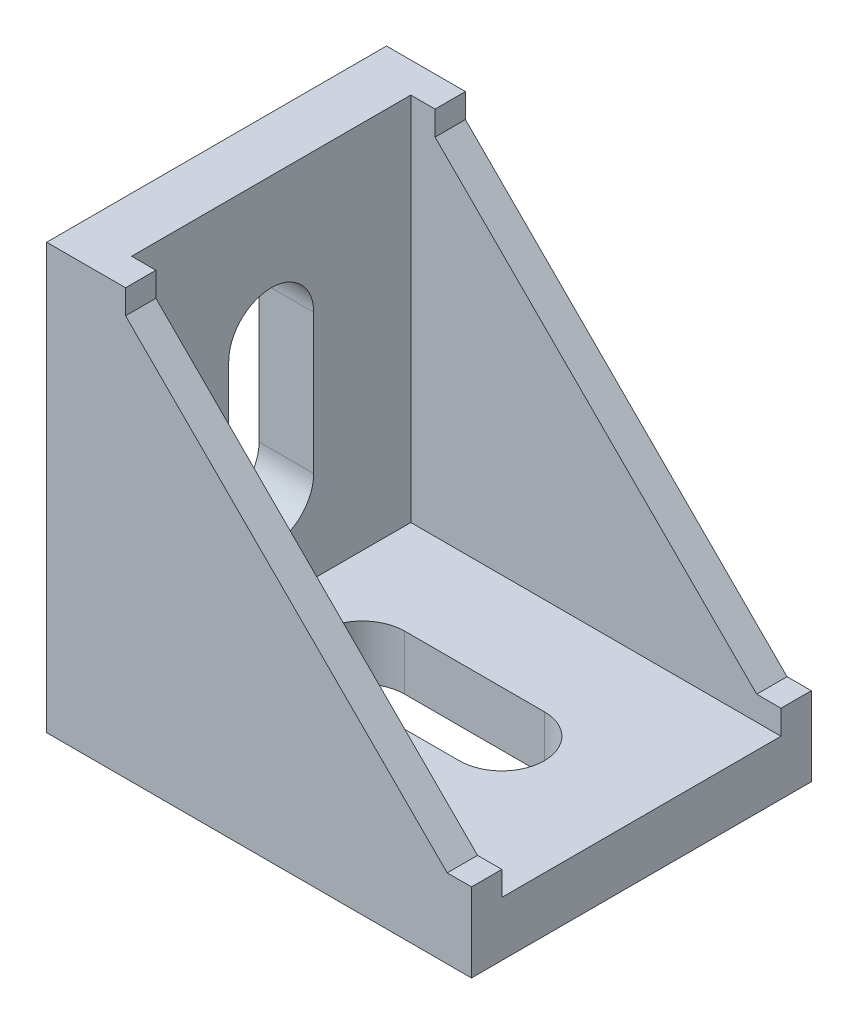
ISO-10303-21;
HEADER;
FILE_DESCRIPTION(('STEP AP214'),'2;1');
FILE_NAME('part.step','',(''),(''),'','','');
FILE_SCHEMA(('AUTOMOTIVE_DESIGN { 1 0 10303 214 1 1 1 1 }'));
ENDSEC;
DATA;
#1=APPLICATION_CONTEXT('core data for automotive mechanical design processes');
#2=APPLICATION_PROTOCOL_DEFINITION('international standard','automotive_design',2000,#1);
#3=PRODUCT_CONTEXT('',#1,'mechanical');
#4=PRODUCT('Part','Part','',(#3));
#5=PRODUCT_RELATED_PRODUCT_CATEGORY('part','',(#4));
#6=PRODUCT_DEFINITION_FORMATION('','',#4);
#7=PRODUCT_DEFINITION_CONTEXT('part definition',#1,'design');
#8=PRODUCT_DEFINITION('design','',#6,#7);
#9=PRODUCT_DEFINITION_SHAPE('','',#8);
#10=(LENGTH_UNIT() NAMED_UNIT(*) SI_UNIT(.MILLI.,.METRE.));
#11=(NAMED_UNIT(*) PLANE_ANGLE_UNIT() SI_UNIT($,.RADIAN.));
#12=(NAMED_UNIT(*) SI_UNIT($,.STERADIAN.) SOLID_ANGLE_UNIT());
#13=UNCERTAINTY_MEASURE_WITH_UNIT(LENGTH_MEASURE(1.E-05),#10,'distance_accuracy_value','');
#14=(GEOMETRIC_REPRESENTATION_CONTEXT(3) GLOBAL_UNCERTAINTY_ASSIGNED_CONTEXT((#13)) GLOBAL_UNIT_ASSIGNED_CONTEXT((#10,
#11,#12)) REPRESENTATION_CONTEXT('',''));
#15=CARTESIAN_POINT('',(0.,0.,0.));
#16=DIRECTION('',(0.,0.,1.));
#17=DIRECTION('',(1.,0.,0.));
#18=AXIS2_PLACEMENT_3D('',#15,#16,#17);
#19=CARTESIAN_POINT('',(0.,0.,28.));
#20=DIRECTION('',(1.,0.,0.));
#21=DIRECTION('',(0.,0.,-1.));
#22=AXIS2_PLACEMENT_3D('',#19,#20,#21);
#23=PLANE('',#22);
#24=DIRECTION('',(0.,-1.,0.));
#25=VECTOR('',#24,1.);
#26=CARTESIAN_POINT('',(0.,0.,0.));
#27=LINE('',#26,#25);
#28=CARTESIAN_POINT('',(0.,35.,0.));
#29=VERTEX_POINT('',#28);
#30=CARTESIAN_POINT('',(0.,0.,0.));
#31=VERTEX_POINT('',#30);
#32=EDGE_CURVE('E415',#29,#31,#27,.T.);
#33=ORIENTED_EDGE('',*,*,#32,.T.);
#34=DIRECTION('',(0.,0.,-1.));
#35=VECTOR('',#34,1.);
#36=CARTESIAN_POINT('',(0.,0.,28.));
#37=LINE('',#36,#35);
#38=CARTESIAN_POINT('',(0.,0.,28.));
#39=VERTEX_POINT('',#38);
#40=EDGE_CURVE('E441',#39,#31,#37,.T.);
#41=ORIENTED_EDGE('',*,*,#40,.F.);
#42=DIRECTION('',(0.,-1.,0.));
#43=VECTOR('',#42,1.);
#44=CARTESIAN_POINT('',(0.,0.,28.));
#45=LINE('',#44,#43);
#46=CARTESIAN_POINT('',(0.,35.,28.));
#47=VERTEX_POINT('',#46);
#48=EDGE_CURVE('E416',#47,#39,#45,.T.);
#49=ORIENTED_EDGE('',*,*,#48,.F.);
#50=DIRECTION('',(0.,0.,-1.));
#51=VECTOR('',#50,1.);
#52=CARTESIAN_POINT('',(0.,35.,28.));
#53=LINE('',#52,#51);
#54=EDGE_CURVE('E427',#47,#29,#53,.T.);
#55=ORIENTED_EDGE('',*,*,#54,.T.);
#56=EDGE_LOOP('',(#33,#41,#49,#55));
#57=FACE_BOUND('',#56,.T.);
#58=DIRECTION('',(0.,-1.,0.));
#59=VECTOR('',#58,1.);
#60=CARTESIAN_POINT('',(0.,23.5,10.5));
#61=LINE('',#60,#59);
#62=CARTESIAN_POINT('',(0.,23.5,10.5));
#63=VERTEX_POINT('',#62);
#64=CARTESIAN_POINT('',(0.,12.,10.5));
#65=VERTEX_POINT('',#64);
#66=EDGE_CURVE('E322',#63,#65,#61,.T.);
#67=ORIENTED_EDGE('',*,*,#66,.F.);
#68=CARTESIAN_POINT('',(0.,23.5,14.));
#69=DIRECTION('',(1.,0.,0.));
#70=DIRECTION('',(0.,0.,-1.));
#71=AXIS2_PLACEMENT_3D('',#68,#69,#70);
#72=CIRCLE('',#71,3.5);
#73=CARTESIAN_POINT('',(0.,23.5,17.5));
#74=VERTEX_POINT('',#73);
#75=EDGE_CURVE('E325',#74,#63,#72,.F.);
#76=ORIENTED_EDGE('',*,*,#75,.F.);
#77=DIRECTION('',(0.,1.,0.));
#78=VECTOR('',#77,1.);
#79=CARTESIAN_POINT('',(0.,12.,17.5));
#80=LINE('',#79,#78);
#81=CARTESIAN_POINT('',(0.,12.,17.5));
#82=VERTEX_POINT('',#81);
#83=EDGE_CURVE('E327',#82,#74,#80,.T.);
#84=ORIENTED_EDGE('',*,*,#83,.F.);
#85=CARTESIAN_POINT('',(0.,12.,14.));
#86=DIRECTION('',(1.,0.,0.));
#87=DIRECTION('',(0.,0.,-1.));
#88=AXIS2_PLACEMENT_3D('',#85,#86,#87);
#89=CIRCLE('',#88,3.5);
#90=EDGE_CURVE('E319',#65,#82,#89,.F.);
#91=ORIENTED_EDGE('',*,*,#90,.F.);
#92=EDGE_LOOP('',(#67,#76,#84,#91));
#93=FACE_BOUND('',#92,.T.);
#94=DIRECTION('',(0.,-1.,0.));
#95=VECTOR('',#94,1.);
#96=CARTESIAN_POINT('',(0.,34.,11.1));
#97=LINE('',#96,#95);
#98=CARTESIAN_POINT('',(0.,34.,11.1));
#99=VERTEX_POINT('',#98);
#100=CARTESIAN_POINT('',(0.,33.,11.1));
#101=VERTEX_POINT('',#100);
#102=EDGE_CURVE('E250',#99,#101,#97,.T.);
#103=ORIENTED_EDGE('',*,*,#102,.F.);
#104=DIRECTION('',(0.,0.,-1.));
#105=VECTOR('',#104,1.);
#106=CARTESIAN_POINT('',(0.,34.,16.9));
#107=LINE('',#106,#105);
#108=CARTESIAN_POINT('',(0.,34.,16.9));
#109=VERTEX_POINT('',#108);
#110=EDGE_CURVE('E247',#109,#99,#107,.T.);
#111=ORIENTED_EDGE('',*,*,#110,.F.);
#112=DIRECTION('',(0.,1.,0.));
#113=VECTOR('',#112,1.);
#114=CARTESIAN_POINT('',(0.,34.,16.9));
#115=LINE('',#114,#113);
#116=CARTESIAN_POINT('',(0.,33.,16.9));
#117=VERTEX_POINT('',#116);
#118=EDGE_CURVE('E53',#117,#109,#115,.T.);
#119=ORIENTED_EDGE('',*,*,#118,.F.);
#120=DIRECTION('',(0.,0.,1.));
#121=VECTOR('',#120,1.);
#122=CARTESIAN_POINT('',(0.,33.,16.9));
#123=LINE('',#122,#121);
#124=EDGE_CURVE('E48',#101,#117,#123,.T.);
#125=ORIENTED_EDGE('',*,*,#124,.F.);
#126=EDGE_LOOP('',(#103,#111,#119,#125));
#127=FACE_BOUND('',#126,.T.);
#128=ADVANCED_FACE('F34',(#57,#93,#127),#23,.F.);
#129=CARTESIAN_POINT('',(0.,0.,28.));
#130=DIRECTION('',(0.,1.,0.));
#131=DIRECTION('',(0.,0.,1.));
#132=AXIS2_PLACEMENT_3D('',#129,#130,#131);
#133=PLANE('',#132);
#134=DIRECTION('',(1.,0.,0.));
#135=VECTOR('',#134,1.);
#136=CARTESIAN_POINT('',(0.,0.,0.));
#137=LINE('',#136,#135);
#138=CARTESIAN_POINT('',(35.,0.,0.));
#139=VERTEX_POINT('',#138);
#140=EDGE_CURVE('E430',#31,#139,#137,.T.);
#141=ORIENTED_EDGE('',*,*,#140,.T.);
#142=DIRECTION('',(0.,0.,-1.));
#143=VECTOR('',#142,1.);
#144=CARTESIAN_POINT('',(35.,0.,28.));
#145=LINE('',#144,#143);
#146=CARTESIAN_POINT('',(35.,0.,28.));
#147=VERTEX_POINT('',#146);
#148=EDGE_CURVE('E438',#147,#139,#145,.T.);
#149=ORIENTED_EDGE('',*,*,#148,.F.);
#150=DIRECTION('',(1.,0.,0.));
#151=VECTOR('',#150,1.);
#152=CARTESIAN_POINT('',(0.,0.,28.));
#153=LINE('',#152,#151);
#154=EDGE_CURVE('E419',#39,#147,#153,.T.);
#155=ORIENTED_EDGE('',*,*,#154,.F.);
#156=ORIENTED_EDGE('',*,*,#40,.T.);
#157=EDGE_LOOP('',(#141,#149,#155,#156));
#158=FACE_BOUND('',#157,.T.);
#159=DIRECTION('',(-1.,0.,0.));
#160=VECTOR('',#159,1.);
#161=CARTESIAN_POINT('',(23.5,0.,17.5));
#162=LINE('',#161,#160);
#163=CARTESIAN_POINT('',(23.5,0.,17.5));
#164=VERTEX_POINT('',#163);
#165=CARTESIAN_POINT('',(12.,0.,17.5));
#166=VERTEX_POINT('',#165);
#167=EDGE_CURVE('E293',#164,#166,#162,.T.);
#168=ORIENTED_EDGE('',*,*,#167,.F.);
#169=CARTESIAN_POINT('',(23.5,0.,14.));
#170=DIRECTION('',(0.,1.,0.));
#171=DIRECTION('',(0.,0.,1.));
#172=AXIS2_PLACEMENT_3D('',#169,#170,#171);
#173=CIRCLE('',#172,3.5);
#174=CARTESIAN_POINT('',(23.5,0.,10.5));
#175=VERTEX_POINT('',#174);
#176=EDGE_CURVE('E296',#175,#164,#173,.F.);
#177=ORIENTED_EDGE('',*,*,#176,.F.);
#178=DIRECTION('',(1.,0.,0.));
#179=VECTOR('',#178,1.);
#180=CARTESIAN_POINT('',(12.,0.,10.5));
#181=LINE('',#180,#179);
#182=CARTESIAN_POINT('',(12.,0.,10.5));
#183=VERTEX_POINT('',#182);
#184=EDGE_CURVE('E298',#183,#175,#181,.T.);
#185=ORIENTED_EDGE('',*,*,#184,.F.);
#186=CARTESIAN_POINT('',(12.,0.,14.));
#187=DIRECTION('',(0.,1.,0.));
#188=DIRECTION('',(0.,0.,1.));
#189=AXIS2_PLACEMENT_3D('',#186,#187,#188);
#190=CIRCLE('',#189,3.5);
#191=EDGE_CURVE('E290',#166,#183,#190,.F.);
#192=ORIENTED_EDGE('',*,*,#191,.F.);
#193=EDGE_LOOP('',(#168,#177,#185,#192));
#194=FACE_BOUND('',#193,.T.);
#195=DIRECTION('',(-1.,0.,0.));
#196=VECTOR('',#195,1.);
#197=CARTESIAN_POINT('',(34.,0.,16.9));
#198=LINE('',#197,#196);
#199=CARTESIAN_POINT('',(34.,0.,16.9));
#200=VERTEX_POINT('',#199);
#201=CARTESIAN_POINT('',(33.,0.,16.9));
#202=VERTEX_POINT('',#201);
#203=EDGE_CURVE('E251',#200,#202,#198,.T.);
#204=ORIENTED_EDGE('',*,*,#203,.F.);
#205=DIRECTION('',(0.,0.,1.));
#206=VECTOR('',#205,1.);
#207=CARTESIAN_POINT('',(34.,0.,16.9));
#208=LINE('',#207,#206);
#209=CARTESIAN_POINT('',(34.,0.,11.1));
#210=VERTEX_POINT('',#209);
#211=EDGE_CURVE('E264',#210,#200,#208,.T.);
#212=ORIENTED_EDGE('',*,*,#211,.F.);
#213=DIRECTION('',(1.,0.,0.));
#214=VECTOR('',#213,1.);
#215=CARTESIAN_POINT('',(34.,0.,11.1));
#216=LINE('',#215,#214);
#217=CARTESIAN_POINT('',(33.,0.,11.1));
#218=VERTEX_POINT('',#217);
#219=EDGE_CURVE('E273',#218,#210,#216,.T.);
#220=ORIENTED_EDGE('',*,*,#219,.F.);
#221=DIRECTION('',(0.,0.,-1.));
#222=VECTOR('',#221,1.);
#223=CARTESIAN_POINT('',(33.,0.,16.9));
#224=LINE('',#223,#222);
#225=EDGE_CURVE('E254',#202,#218,#224,.T.);
#226=ORIENTED_EDGE('',*,*,#225,.F.);
#227=EDGE_LOOP('',(#204,#212,#220,#226));
#228=FACE_BOUND('',#227,.T.);
#229=ADVANCED_FACE('F495',(#158,#194,#228),#133,.F.);
#230=CARTESIAN_POINT('',(6.5,37.0820212779744,0.));
#231=DIRECTION('',(-1.,0.,0.));
#232=DIRECTION('',(0.,0.,1.));
#233=AXIS2_PLACEMENT_3D('',#230,#231,#232);
#234=PLANE('',#233);
#235=DIRECTION('',(0.,0.,1.));
#236=VECTOR('',#235,1.);
#237=CARTESIAN_POINT('',(6.5,33.,0.));
#238=LINE('',#237,#236);
#239=CARTESIAN_POINT('',(6.5,33.,25.5));
#240=VERTEX_POINT('',#239);
#241=CARTESIAN_POINT('',(6.5,33.,28.));
#242=VERTEX_POINT('',#241);
#243=EDGE_CURVE('E404',#240,#242,#238,.T.);
#244=ORIENTED_EDGE('',*,*,#243,.F.);
#245=DIRECTION('',(0.,1.,0.));
#246=VECTOR('',#245,1.);
#247=CARTESIAN_POINT('',(6.5,37.0820212779744,25.5));
#248=LINE('',#247,#246);
#249=CARTESIAN_POINT('',(6.5,35.,25.5));
#250=VERTEX_POINT('',#249);
#251=EDGE_CURVE('E378',#240,#250,#248,.T.);
#252=ORIENTED_EDGE('',*,*,#251,.T.);
#253=DIRECTION('',(0.,0.,-1.));
#254=VECTOR('',#253,1.);
#255=CARTESIAN_POINT('',(6.5,35.,28.));
#256=LINE('',#255,#254);
#257=CARTESIAN_POINT('',(6.5,35.,28.));
#258=VERTEX_POINT('',#257);
#259=EDGE_CURVE('E412',#258,#250,#256,.T.);
#260=ORIENTED_EDGE('',*,*,#259,.F.);
#261=DIRECTION('',(0.,-1.,0.));
#262=VECTOR('',#261,1.);
#263=CARTESIAN_POINT('',(6.5,37.0820212779744,28.));
#264=LINE('',#263,#262);
#265=EDGE_CURVE('E389',#258,#242,#264,.T.);
#266=ORIENTED_EDGE('',*,*,#265,.T.);
#267=EDGE_LOOP('',(#244,#252,#260,#266));
#268=FACE_BOUND('',#267,.T.);
#269=ADVANCED_FACE('F456',(#268),#234,.F.);
#270=CARTESIAN_POINT('',(33.,6.5,0.));
#271=DIRECTION('',(0.,-1.,0.));
#272=DIRECTION('',(0.,0.,-1.));
#273=AXIS2_PLACEMENT_3D('',#270,#271,#272);
#274=PLANE('',#273);
#275=DIRECTION('',(0.,0.,1.));
#276=VECTOR('',#275,1.);
#277=CARTESIAN_POINT('',(35.,6.5,28.));
#278=LINE('',#277,#276);
#279=CARTESIAN_POINT('',(35.,6.5,25.5));
#280=VERTEX_POINT('',#279);
#281=CARTESIAN_POINT('',(35.,6.5,28.));
#282=VERTEX_POINT('',#281);
#283=EDGE_CURVE('E403',#280,#282,#278,.T.);
#284=ORIENTED_EDGE('',*,*,#283,.F.);
#285=DIRECTION('',(-1.,0.,0.));
#286=VECTOR('',#285,1.);
#287=CARTESIAN_POINT('',(33.,6.5,25.5));
#288=LINE('',#287,#286);
#289=CARTESIAN_POINT('',(33.,6.5,25.5));
#290=VERTEX_POINT('',#289);
#291=EDGE_CURVE('E375',#280,#290,#288,.T.);
#292=ORIENTED_EDGE('',*,*,#291,.T.);
#293=DIRECTION('',(0.,0.,1.));
#294=VECTOR('',#293,1.);
#295=CARTESIAN_POINT('',(33.,6.5,0.));
#296=LINE('',#295,#294);
#297=CARTESIAN_POINT('',(33.,6.5,28.));
#298=VERTEX_POINT('',#297);
#299=EDGE_CURVE('E392',#290,#298,#296,.T.);
#300=ORIENTED_EDGE('',*,*,#299,.T.);
#301=DIRECTION('',(1.,0.,0.));
#302=VECTOR('',#301,1.);
#303=CARTESIAN_POINT('',(33.,6.5,28.));
#304=LINE('',#303,#302);
#305=EDGE_CURVE('E395',#298,#282,#304,.T.);
#306=ORIENTED_EDGE('',*,*,#305,.T.);
#307=EDGE_LOOP('',(#284,#292,#300,#306));
#308=FACE_BOUND('',#307,.T.);
#309=ADVANCED_FACE('F466',(#308),#274,.F.);
#310=CARTESIAN_POINT('',(6.5,33.,0.));
#311=DIRECTION('',(-0.707106781186547,-0.707106781186547,0.));
#312=DIRECTION('',(0.707106781186548,-0.707106781186548,0.));
#313=AXIS2_PLACEMENT_3D('',#310,#311,#312);
#314=PLANE('',#313);
#315=ORIENTED_EDGE('',*,*,#299,.F.);
#316=DIRECTION('',(-0.707106781186548,0.707106781186548,0.));
#317=VECTOR('',#316,1.);
#318=CARTESIAN_POINT('',(6.5,33.,25.5));
#319=LINE('',#318,#317);
#320=EDGE_CURVE('E41',#290,#240,#319,.T.);
#321=ORIENTED_EDGE('',*,*,#320,.T.);
#322=ORIENTED_EDGE('',*,*,#243,.T.);
#323=DIRECTION('',(0.707106781186548,-0.707106781186548,0.));
#324=VECTOR('',#323,1.);
#325=CARTESIAN_POINT('',(6.5,33.,28.));
#326=LINE('',#325,#324);
#327=EDGE_CURVE('E384',#242,#298,#326,.T.);
#328=ORIENTED_EDGE('',*,*,#327,.T.);
#329=EDGE_LOOP('',(#315,#321,#322,#328));
#330=FACE_BOUND('',#329,.T.);
#331=ADVANCED_FACE('F453',(#330),#314,.F.);
#332=CARTESIAN_POINT('',(35.,0.,28.));
#333=DIRECTION('',(-1.,0.,0.));
#334=DIRECTION('',(0.,0.,1.));
#335=AXIS2_PLACEMENT_3D('',#332,#333,#334);
#336=PLANE('',#335);
#337=DIRECTION('',(0.,0.,-1.));
#338=VECTOR('',#337,1.);
#339=CARTESIAN_POINT('',(35.,4.5,25.5));
#340=LINE('',#339,#338);
#341=CARTESIAN_POINT('',(35.,4.5,25.5));
#342=VERTEX_POINT('',#341);
#343=CARTESIAN_POINT('',(35.,4.5,2.5));
#344=VERTEX_POINT('',#343);
#345=EDGE_CURVE('E348',#342,#344,#340,.T.);
#346=ORIENTED_EDGE('',*,*,#345,.F.);
#347=DIRECTION('',(0.,-1.,0.));
#348=VECTOR('',#347,1.);
#349=CARTESIAN_POINT('',(35.,38.2170301545957,25.5));
#350=LINE('',#349,#348);
#351=EDGE_CURVE('E350',#280,#342,#350,.T.);
#352=ORIENTED_EDGE('',*,*,#351,.F.);
#353=ORIENTED_EDGE('',*,*,#283,.T.);
#354=DIRECTION('',(0.,1.,0.));
#355=VECTOR('',#354,1.);
#356=CARTESIAN_POINT('',(35.,0.,28.));
#357=LINE('',#356,#355);
#358=EDGE_CURVE('E422',#147,#282,#357,.T.);
#359=ORIENTED_EDGE('',*,*,#358,.F.);
#360=ORIENTED_EDGE('',*,*,#148,.T.);
#361=DIRECTION('',(0.,1.,0.));
#362=VECTOR('',#361,1.);
#363=CARTESIAN_POINT('',(35.,0.,0.));
#364=LINE('',#363,#362);
#365=CARTESIAN_POINT('',(35.,6.5,0.));
#366=VERTEX_POINT('',#365);
#367=EDGE_CURVE('E432',#139,#366,#364,.T.);
#368=ORIENTED_EDGE('',*,*,#367,.T.);
#369=CARTESIAN_POINT('',(35.,6.5,2.5));
#370=VERTEX_POINT('',#369);
#371=EDGE_CURVE('E408',#366,#370,#278,.T.);
#372=ORIENTED_EDGE('',*,*,#371,.T.);
#373=DIRECTION('',(0.,1.,0.));
#374=VECTOR('',#373,1.);
#375=CARTESIAN_POINT('',(35.,38.2170301545957,2.5));
#376=LINE('',#375,#374);
#377=EDGE_CURVE('E353',#344,#370,#376,.T.);
#378=ORIENTED_EDGE('',*,*,#377,.F.);
#379=EDGE_LOOP('',(#346,#352,#353,#359,#360,#368,#372,#378));
#380=FACE_BOUND('',#379,.T.);
#381=ADVANCED_FACE('F472',(#380),#336,.F.);
#382=CARTESIAN_POINT('',(0.,35.,28.));
#383=DIRECTION('',(0.,-1.,0.));
#384=DIRECTION('',(0.,0.,-1.));
#385=AXIS2_PLACEMENT_3D('',#382,#383,#384);
#386=PLANE('',#385);
#387=ORIENTED_EDGE('',*,*,#259,.T.);
#388=DIRECTION('',(-1.,0.,0.));
#389=VECTOR('',#388,1.);
#390=CARTESIAN_POINT('',(0.,35.,25.5));
#391=LINE('',#390,#389);
#392=CARTESIAN_POINT('',(4.5,35.,25.5));
#393=VERTEX_POINT('',#392);
#394=EDGE_CURVE('E381',#250,#393,#391,.T.);
#395=ORIENTED_EDGE('',*,*,#394,.T.);
#396=DIRECTION('',(0.,0.,-1.));
#397=VECTOR('',#396,1.);
#398=CARTESIAN_POINT('',(4.5,35.,28.));
#399=LINE('',#398,#397);
#400=CARTESIAN_POINT('',(4.5,35.,2.5));
#401=VERTEX_POINT('',#400);
#402=EDGE_CURVE('E11',#393,#401,#399,.T.);
#403=ORIENTED_EDGE('',*,*,#402,.T.);
#404=DIRECTION('',(1.,0.,0.));
#405=VECTOR('',#404,1.);
#406=CARTESIAN_POINT('',(0.,35.,2.5));
#407=LINE('',#406,#405);
#408=CARTESIAN_POINT('',(6.5,35.,2.5));
#409=VERTEX_POINT('',#408);
#410=EDGE_CURVE('E372',#401,#409,#407,.T.);
#411=ORIENTED_EDGE('',*,*,#410,.T.);
#412=CARTESIAN_POINT('',(6.5,35.,0.));
#413=VERTEX_POINT('',#412);
#414=EDGE_CURVE('E411',#409,#413,#256,.T.);
#415=ORIENTED_EDGE('',*,*,#414,.T.);
#416=DIRECTION('',(-1.,0.,0.));
#417=VECTOR('',#416,1.);
#418=CARTESIAN_POINT('',(0.,35.,0.));
#419=LINE('',#418,#417);
#420=EDGE_CURVE('E420',#413,#29,#419,.T.);
#421=ORIENTED_EDGE('',*,*,#420,.T.);
#422=ORIENTED_EDGE('',*,*,#54,.F.);
#423=DIRECTION('',(-1.,0.,0.));
#424=VECTOR('',#423,1.);
#425=CARTESIAN_POINT('',(0.,35.,28.));
#426=LINE('',#425,#424);
#427=EDGE_CURVE('E425',#258,#47,#426,.T.);
#428=ORIENTED_EDGE('',*,*,#427,.F.);
#429=EDGE_LOOP('',(#387,#395,#403,#411,#415,#421,#422,#428));
#430=FACE_BOUND('',#429,.T.);
#431=ADVANCED_FACE('F485',(#430),#386,.F.);
#432=CARTESIAN_POINT('',(0.,0.,28.));
#433=DIRECTION('',(0.,0.,-1.));
#434=DIRECTION('',(-1.,0.,0.));
#435=AXIS2_PLACEMENT_3D('',#432,#433,#434);
#436=PLANE('',#435);
#437=ORIENTED_EDGE('',*,*,#327,.F.);
#438=ORIENTED_EDGE('',*,*,#265,.F.);
#439=ORIENTED_EDGE('',*,*,#427,.T.);
#440=ORIENTED_EDGE('',*,*,#48,.T.);
#441=ORIENTED_EDGE('',*,*,#154,.T.);
#442=ORIENTED_EDGE('',*,*,#358,.T.);
#443=ORIENTED_EDGE('',*,*,#305,.F.);
#444=EDGE_LOOP('',(#437,#438,#439,#440,#441,#442,#443));
#445=FACE_BOUND('',#444,.T.);
#446=ADVANCED_FACE('F462',(#445),#436,.F.);
#447=CARTESIAN_POINT('',(0.,0.,0.));
#448=DIRECTION('',(0.,0.,-1.));
#449=DIRECTION('',(-1.,0.,0.));
#450=AXIS2_PLACEMENT_3D('',#447,#448,#449);
#451=PLANE('',#450);
#452=DIRECTION('',(0.,1.,0.));
#453=VECTOR('',#452,1.);
#454=CARTESIAN_POINT('',(6.5,0.,0.));
#455=LINE('',#454,#453);
#456=CARTESIAN_POINT('',(6.5,33.,0.));
#457=VERTEX_POINT('',#456);
#458=EDGE_CURVE('E444',#457,#413,#455,.T.);
#459=ORIENTED_EDGE('',*,*,#458,.F.);
#460=DIRECTION('',(0.707106781186548,-0.707106781186548,0.));
#461=VECTOR('',#460,1.);
#462=CARTESIAN_POINT('',(6.5,33.,0.));
#463=LINE('',#462,#461);
#464=CARTESIAN_POINT('',(33.,6.5,0.));
#465=VERTEX_POINT('',#464);
#466=EDGE_CURVE('E385',#457,#465,#463,.T.);
#467=ORIENTED_EDGE('',*,*,#466,.T.);
#468=DIRECTION('',(1.,0.,0.));
#469=VECTOR('',#468,1.);
#470=CARTESIAN_POINT('',(33.,6.5,0.));
#471=LINE('',#470,#469);
#472=EDGE_CURVE('E388',#465,#366,#471,.T.);
#473=ORIENTED_EDGE('',*,*,#472,.T.);
#474=ORIENTED_EDGE('',*,*,#367,.F.);
#475=ORIENTED_EDGE('',*,*,#140,.F.);
#476=ORIENTED_EDGE('',*,*,#32,.F.);
#477=ORIENTED_EDGE('',*,*,#420,.F.);
#478=EDGE_LOOP('',(#459,#467,#473,#474,#475,#476,#477));
#479=FACE_BOUND('',#478,.T.);
#480=ADVANCED_FACE('F500',(#479),#451,.T.);
#481=ORIENTED_EDGE('',*,*,#414,.F.);
#482=DIRECTION('',(0.,-1.,0.));
#483=VECTOR('',#482,1.);
#484=CARTESIAN_POINT('',(6.5,37.0820212779744,2.5));
#485=LINE('',#484,#483);
#486=CARTESIAN_POINT('',(6.5,33.,2.5));
#487=VERTEX_POINT('',#486);
#488=EDGE_CURVE('E369',#409,#487,#485,.T.);
#489=ORIENTED_EDGE('',*,*,#488,.T.);
#490=EDGE_CURVE('E400',#457,#487,#238,.T.);
#491=ORIENTED_EDGE('',*,*,#490,.F.);
#492=ORIENTED_EDGE('',*,*,#458,.T.);
#493=EDGE_LOOP('',(#481,#489,#491,#492));
#494=FACE_BOUND('',#493,.T.);
#495=ADVANCED_FACE('F508',(#494),#234,.F.);
#496=CARTESIAN_POINT('',(33.,6.5,2.5));
#497=VERTEX_POINT('',#496);
#498=EDGE_CURVE('E405',#465,#497,#296,.T.);
#499=ORIENTED_EDGE('',*,*,#498,.T.);
#500=DIRECTION('',(1.,0.,0.));
#501=VECTOR('',#500,1.);
#502=CARTESIAN_POINT('',(33.,6.5,2.5));
#503=LINE('',#502,#501);
#504=EDGE_CURVE('E366',#497,#370,#503,.T.);
#505=ORIENTED_EDGE('',*,*,#504,.T.);
#506=ORIENTED_EDGE('',*,*,#371,.F.);
#507=ORIENTED_EDGE('',*,*,#472,.F.);
#508=EDGE_LOOP('',(#499,#505,#506,#507));
#509=FACE_BOUND('',#508,.T.);
#510=ADVANCED_FACE('F504',(#509),#274,.F.);
#511=ORIENTED_EDGE('',*,*,#490,.T.);
#512=DIRECTION('',(0.707106781186548,-0.707106781186548,0.));
#513=VECTOR('',#512,1.);
#514=CARTESIAN_POINT('',(6.5,33.,2.5));
#515=LINE('',#514,#513);
#516=EDGE_CURVE('E447',#487,#497,#515,.T.);
#517=ORIENTED_EDGE('',*,*,#516,.T.);
#518=ORIENTED_EDGE('',*,*,#498,.F.);
#519=ORIENTED_EDGE('',*,*,#466,.F.);
#520=EDGE_LOOP('',(#511,#517,#518,#519));
#521=FACE_BOUND('',#520,.T.);
#522=ADVANCED_FACE('F506',(#521),#314,.F.);
#523=CARTESIAN_POINT('',(4.5,0.,0.));
#524=DIRECTION('',(-1.,0.,0.));
#525=DIRECTION('',(0.,0.,1.));
#526=AXIS2_PLACEMENT_3D('',#523,#524,#525);
#527=PLANE('',#526);
#528=DIRECTION('',(0.,-1.,0.));
#529=VECTOR('',#528,1.);
#530=CARTESIAN_POINT('',(4.5,12.,17.5));
#531=LINE('',#530,#529);
#532=CARTESIAN_POINT('',(4.5,23.5,17.5));
#533=VERTEX_POINT('',#532);
#534=CARTESIAN_POINT('',(4.5,12.,17.5));
#535=VERTEX_POINT('',#534);
#536=EDGE_CURVE('E329',#533,#535,#531,.T.);
#537=ORIENTED_EDGE('',*,*,#536,.F.);
#538=CARTESIAN_POINT('',(4.5,23.5,14.));
#539=DIRECTION('',(1.,0.,0.));
#540=DIRECTION('',(0.,0.,-1.));
#541=AXIS2_PLACEMENT_3D('',#538,#539,#540);
#542=CIRCLE('',#541,3.5);
#543=CARTESIAN_POINT('',(4.5,23.5,10.5));
#544=VERTEX_POINT('',#543);
#545=EDGE_CURVE('E318',#544,#533,#542,.T.);
#546=ORIENTED_EDGE('',*,*,#545,.F.);
#547=DIRECTION('',(0.,1.,0.));
#548=VECTOR('',#547,1.);
#549=CARTESIAN_POINT('',(4.5,23.5,10.5));
#550=LINE('',#549,#548);
#551=CARTESIAN_POINT('',(4.5,12.,10.5));
#552=VERTEX_POINT('',#551);
#553=EDGE_CURVE('E335',#552,#544,#550,.T.);
#554=ORIENTED_EDGE('',*,*,#553,.F.);
#555=CARTESIAN_POINT('',(4.5,12.,14.));
#556=DIRECTION('',(1.,0.,0.));
#557=DIRECTION('',(0.,0.,-1.));
#558=AXIS2_PLACEMENT_3D('',#555,#556,#557);
#559=CIRCLE('',#558,3.5);
#560=EDGE_CURVE('E332',#535,#552,#559,.T.);
#561=ORIENTED_EDGE('',*,*,#560,.F.);
#562=EDGE_LOOP('',(#537,#546,#554,#561));
#563=FACE_BOUND('',#562,.T.);
#564=DIRECTION('',(0.,1.,0.));
#565=VECTOR('',#564,1.);
#566=CARTESIAN_POINT('',(4.5,38.2170301545957,25.5));
#567=LINE('',#566,#565);
#568=CARTESIAN_POINT('',(4.5,4.5,25.5));
#569=VERTEX_POINT('',#568);
#570=EDGE_CURVE('E358',#569,#393,#567,.T.);
#571=ORIENTED_EDGE('',*,*,#570,.F.);
#572=DIRECTION('',(0.,0.,1.));
#573=VECTOR('',#572,1.);
#574=CARTESIAN_POINT('',(4.5,4.5,25.5));
#575=LINE('',#574,#573);
#576=CARTESIAN_POINT('',(4.5,4.5,2.5));
#577=VERTEX_POINT('',#576);
#578=EDGE_CURVE('E355',#577,#569,#575,.T.);
#579=ORIENTED_EDGE('',*,*,#578,.F.);
#580=DIRECTION('',(0.,-1.,0.));
#581=VECTOR('',#580,1.);
#582=CARTESIAN_POINT('',(4.5,38.2170301545957,2.5));
#583=LINE('',#582,#581);
#584=EDGE_CURVE('E347',#401,#577,#583,.T.);
#585=ORIENTED_EDGE('',*,*,#584,.F.);
#586=ORIENTED_EDGE('',*,*,#402,.F.);
#587=EDGE_LOOP('',(#571,#579,#585,#586));
#588=FACE_BOUND('',#587,.T.);
#589=ADVANCED_FACE('F483',(#563,#588),#527,.F.);
#590=CARTESIAN_POINT('',(75.8146802320674,38.2170301545957,25.5));
#591=DIRECTION('',(0.,0.,1.));
#592=DIRECTION('',(1.,0.,0.));
#593=AXIS2_PLACEMENT_3D('',#590,#591,#592);
#594=PLANE('',#593);
#595=ORIENTED_EDGE('',*,*,#251,.F.);
#596=ORIENTED_EDGE('',*,*,#320,.F.);
#597=ORIENTED_EDGE('',*,*,#291,.F.);
#598=ORIENTED_EDGE('',*,*,#351,.T.);
#599=DIRECTION('',(-1.,0.,0.));
#600=VECTOR('',#599,1.);
#601=CARTESIAN_POINT('',(75.8146802320674,4.5,25.5));
#602=LINE('',#601,#600);
#603=EDGE_CURVE('E351',#342,#569,#602,.T.);
#604=ORIENTED_EDGE('',*,*,#603,.T.);
#605=ORIENTED_EDGE('',*,*,#570,.T.);
#606=ORIENTED_EDGE('',*,*,#394,.F.);
#607=EDGE_LOOP('',(#595,#596,#597,#598,#604,#605,#606));
#608=FACE_BOUND('',#607,.T.);
#609=ADVANCED_FACE('F468',(#608),#594,.F.);
#610=CARTESIAN_POINT('',(75.8146802320674,38.2170301545957,2.5));
#611=DIRECTION('',(0.,0.,-1.));
#612=DIRECTION('',(-1.,0.,0.));
#613=AXIS2_PLACEMENT_3D('',#610,#611,#612);
#614=PLANE('',#613);
#615=ORIENTED_EDGE('',*,*,#584,.T.);
#616=DIRECTION('',(-1.,0.,0.));
#617=VECTOR('',#616,1.);
#618=CARTESIAN_POINT('',(75.8146802320674,4.5,2.5));
#619=LINE('',#618,#617);
#620=EDGE_CURVE('E361',#344,#577,#619,.T.);
#621=ORIENTED_EDGE('',*,*,#620,.F.);
#622=ORIENTED_EDGE('',*,*,#377,.T.);
#623=ORIENTED_EDGE('',*,*,#504,.F.);
#624=ORIENTED_EDGE('',*,*,#516,.F.);
#625=ORIENTED_EDGE('',*,*,#488,.F.);
#626=ORIENTED_EDGE('',*,*,#410,.F.);
#627=EDGE_LOOP('',(#615,#621,#622,#623,#624,#625,#626));
#628=FACE_BOUND('',#627,.T.);
#629=ADVANCED_FACE('F479',(#628),#614,.F.);
#630=CARTESIAN_POINT('',(75.8146802320674,4.5,25.5));
#631=DIRECTION('',(0.,-1.,0.));
#632=DIRECTION('',(0.,0.,-1.));
#633=AXIS2_PLACEMENT_3D('',#630,#631,#632);
#634=PLANE('',#633);
#635=DIRECTION('',(-1.,0.,0.));
#636=VECTOR('',#635,1.);
#637=CARTESIAN_POINT('',(12.,4.5,10.5));
#638=LINE('',#637,#636);
#639=CARTESIAN_POINT('',(23.5,4.5,10.5));
#640=VERTEX_POINT('',#639);
#641=CARTESIAN_POINT('',(12.,4.5,10.5));
#642=VERTEX_POINT('',#641);
#643=EDGE_CURVE('E300',#640,#642,#638,.T.);
#644=ORIENTED_EDGE('',*,*,#643,.F.);
#645=CARTESIAN_POINT('',(23.5,4.5,14.));
#646=DIRECTION('',(0.,1.,0.));
#647=DIRECTION('',(0.,0.,1.));
#648=AXIS2_PLACEMENT_3D('',#645,#646,#647);
#649=CIRCLE('',#648,3.5);
#650=CARTESIAN_POINT('',(23.5,4.5,17.5));
#651=VERTEX_POINT('',#650);
#652=EDGE_CURVE('E289',#651,#640,#649,.T.);
#653=ORIENTED_EDGE('',*,*,#652,.F.);
#654=DIRECTION('',(1.,0.,0.));
#655=VECTOR('',#654,1.);
#656=CARTESIAN_POINT('',(23.5,4.5,17.5));
#657=LINE('',#656,#655);
#658=CARTESIAN_POINT('',(12.,4.5,17.5));
#659=VERTEX_POINT('',#658);
#660=EDGE_CURVE('E306',#659,#651,#657,.T.);
#661=ORIENTED_EDGE('',*,*,#660,.F.);
#662=CARTESIAN_POINT('',(12.,4.5,14.));
#663=DIRECTION('',(0.,1.,0.));
#664=DIRECTION('',(0.,0.,1.));
#665=AXIS2_PLACEMENT_3D('',#662,#663,#664);
#666=CIRCLE('',#665,3.5);
#667=EDGE_CURVE('E303',#642,#659,#666,.T.);
#668=ORIENTED_EDGE('',*,*,#667,.F.);
#669=EDGE_LOOP('',(#644,#653,#661,#668));
#670=FACE_BOUND('',#669,.T.);
#671=ORIENTED_EDGE('',*,*,#345,.T.);
#672=ORIENTED_EDGE('',*,*,#620,.T.);
#673=ORIENTED_EDGE('',*,*,#578,.T.);
#674=ORIENTED_EDGE('',*,*,#603,.F.);
#675=EDGE_LOOP('',(#671,#672,#673,#674));
#676=FACE_BOUND('',#675,.T.);
#677=ADVANCED_FACE('F476',(#670,#676),#634,.F.);
#678=CARTESIAN_POINT('',(-19.7800404448525,23.5,14.));
#679=DIRECTION('',(1.,0.,0.));
#680=DIRECTION('',(0.,0.,-1.));
#681=AXIS2_PLACEMENT_3D('',#678,#679,#680);
#682=CYLINDRICAL_SURFACE('',#681,3.5);
#683=ORIENTED_EDGE('',*,*,#75,.T.);
#684=DIRECTION('',(1.,0.,0.));
#685=VECTOR('',#684,1.);
#686=CARTESIAN_POINT('',(-19.7800404448525,23.5,10.5));
#687=LINE('',#686,#685);
#688=EDGE_CURVE('E323',#63,#544,#687,.T.);
#689=ORIENTED_EDGE('',*,*,#688,.T.);
#690=ORIENTED_EDGE('',*,*,#545,.T.);
#691=DIRECTION('',(1.,0.,0.));
#692=VECTOR('',#691,1.);
#693=CARTESIAN_POINT('',(-19.7800404448525,23.5,17.5));
#694=LINE('',#693,#692);
#695=EDGE_CURVE('E338',#74,#533,#694,.T.);
#696=ORIENTED_EDGE('',*,*,#695,.F.);
#697=EDGE_LOOP('',(#683,#689,#690,#696));
#698=FACE_BOUND('',#697,.T.);
#699=ADVANCED_FACE('F619',(#698),#682,.F.);
#700=CARTESIAN_POINT('',(-19.7800404448525,23.5,10.5));
#701=DIRECTION('',(0.,0.,-1.));
#702=DIRECTION('',(-1.,0.,0.));
#703=AXIS2_PLACEMENT_3D('',#700,#701,#702);
#704=PLANE('',#703);
#705=ORIENTED_EDGE('',*,*,#66,.T.);
#706=DIRECTION('',(1.,0.,0.));
#707=VECTOR('',#706,1.);
#708=CARTESIAN_POINT('',(-19.7800404448525,12.,10.5));
#709=LINE('',#708,#707);
#710=EDGE_CURVE('E340',#65,#552,#709,.T.);
#711=ORIENTED_EDGE('',*,*,#710,.T.);
#712=ORIENTED_EDGE('',*,*,#553,.T.);
#713=ORIENTED_EDGE('',*,*,#688,.F.);
#714=EDGE_LOOP('',(#705,#711,#712,#713));
#715=FACE_BOUND('',#714,.T.);
#716=ADVANCED_FACE('F624',(#715),#704,.F.);
#717=CARTESIAN_POINT('',(-19.7800404448525,12.,14.));
#718=DIRECTION('',(1.,0.,0.));
#719=DIRECTION('',(0.,0.,-1.));
#720=AXIS2_PLACEMENT_3D('',#717,#718,#719);
#721=CYLINDRICAL_SURFACE('',#720,3.5);
#722=ORIENTED_EDGE('',*,*,#90,.T.);
#723=DIRECTION('',(1.,0.,0.));
#724=VECTOR('',#723,1.);
#725=CARTESIAN_POINT('',(-19.7800404448525,12.,17.5));
#726=LINE('',#725,#724);
#727=EDGE_CURVE('E342',#82,#535,#726,.T.);
#728=ORIENTED_EDGE('',*,*,#727,.T.);
#729=ORIENTED_EDGE('',*,*,#560,.T.);
#730=ORIENTED_EDGE('',*,*,#710,.F.);
#731=EDGE_LOOP('',(#722,#728,#729,#730));
#732=FACE_BOUND('',#731,.T.);
#733=ADVANCED_FACE('F634',(#732),#721,.F.);
#734=CARTESIAN_POINT('',(-19.7800404448525,12.,17.5));
#735=DIRECTION('',(0.,0.,1.));
#736=DIRECTION('',(1.,0.,0.));
#737=AXIS2_PLACEMENT_3D('',#734,#735,#736);
#738=PLANE('',#737);
#739=ORIENTED_EDGE('',*,*,#83,.T.);
#740=ORIENTED_EDGE('',*,*,#695,.T.);
#741=ORIENTED_EDGE('',*,*,#536,.T.);
#742=ORIENTED_EDGE('',*,*,#727,.F.);
#743=EDGE_LOOP('',(#739,#740,#741,#742));
#744=FACE_BOUND('',#743,.T.);
#745=ADVANCED_FACE('F644',(#744),#738,.F.);
#746=CARTESIAN_POINT('',(23.5,-19.7800404448525,14.));
#747=DIRECTION('',(0.,1.,0.));
#748=DIRECTION('',(0.,0.,1.));
#749=AXIS2_PLACEMENT_3D('',#746,#747,#748);
#750=CYLINDRICAL_SURFACE('',#749,3.5);
#751=ORIENTED_EDGE('',*,*,#176,.T.);
#752=DIRECTION('',(0.,1.,0.));
#753=VECTOR('',#752,1.);
#754=CARTESIAN_POINT('',(23.5,-19.7800404448525,17.5));
#755=LINE('',#754,#753);
#756=EDGE_CURVE('E294',#164,#651,#755,.T.);
#757=ORIENTED_EDGE('',*,*,#756,.T.);
#758=ORIENTED_EDGE('',*,*,#652,.T.);
#759=DIRECTION('',(0.,1.,0.));
#760=VECTOR('',#759,1.);
#761=CARTESIAN_POINT('',(23.5,-19.7800404448525,10.5));
#762=LINE('',#761,#760);
#763=EDGE_CURVE('E309',#175,#640,#762,.T.);
#764=ORIENTED_EDGE('',*,*,#763,.F.);
#765=EDGE_LOOP('',(#751,#757,#758,#764));
#766=FACE_BOUND('',#765,.T.);
#767=ADVANCED_FACE('F654',(#766),#750,.F.);
#768=CARTESIAN_POINT('',(23.5,-19.7800404448525,17.5));
#769=DIRECTION('',(0.,0.,1.));
#770=DIRECTION('',(1.,0.,0.));
#771=AXIS2_PLACEMENT_3D('',#768,#769,#770);
#772=PLANE('',#771);
#773=ORIENTED_EDGE('',*,*,#167,.T.);
#774=DIRECTION('',(0.,1.,0.));
#775=VECTOR('',#774,1.);
#776=CARTESIAN_POINT('',(12.,-19.7800404448525,17.5));
#777=LINE('',#776,#775);
#778=EDGE_CURVE('E311',#166,#659,#777,.T.);
#779=ORIENTED_EDGE('',*,*,#778,.T.);
#780=ORIENTED_EDGE('',*,*,#660,.T.);
#781=ORIENTED_EDGE('',*,*,#756,.F.);
#782=EDGE_LOOP('',(#773,#779,#780,#781));
#783=FACE_BOUND('',#782,.T.);
#784=ADVANCED_FACE('F671',(#783),#772,.F.);
#785=CARTESIAN_POINT('',(12.,-19.7800404448525,14.));
#786=DIRECTION('',(0.,1.,0.));
#787=DIRECTION('',(0.,0.,1.));
#788=AXIS2_PLACEMENT_3D('',#785,#786,#787);
#789=CYLINDRICAL_SURFACE('',#788,3.5);
#790=ORIENTED_EDGE('',*,*,#191,.T.);
#791=DIRECTION('',(0.,1.,0.));
#792=VECTOR('',#791,1.);
#793=CARTESIAN_POINT('',(12.,-19.7800404448525,10.5));
#794=LINE('',#793,#792);
#795=EDGE_CURVE('E313',#183,#642,#794,.T.);
#796=ORIENTED_EDGE('',*,*,#795,.T.);
#797=ORIENTED_EDGE('',*,*,#667,.T.);
#798=ORIENTED_EDGE('',*,*,#778,.F.);
#799=EDGE_LOOP('',(#790,#796,#797,#798));
#800=FACE_BOUND('',#799,.T.);
#801=ADVANCED_FACE('F681',(#800),#789,.F.);
#802=CARTESIAN_POINT('',(12.,-19.7800404448525,10.5));
#803=DIRECTION('',(0.,0.,-1.));
#804=DIRECTION('',(-1.,0.,0.));
#805=AXIS2_PLACEMENT_3D('',#802,#803,#804);
#806=PLANE('',#805);
#807=ORIENTED_EDGE('',*,*,#184,.T.);
#808=ORIENTED_EDGE('',*,*,#763,.T.);
#809=ORIENTED_EDGE('',*,*,#643,.T.);
#810=ORIENTED_EDGE('',*,*,#795,.F.);
#811=EDGE_LOOP('',(#807,#808,#809,#810));
#812=FACE_BOUND('',#811,.T.);
#813=ADVANCED_FACE('F691',(#812),#806,.F.);
#814=CARTESIAN_POINT('',(34.,-1.,16.9));
#815=DIRECTION('',(0.,0.,-1.));
#816=DIRECTION('',(-1.,0.,0.));
#817=AXIS2_PLACEMENT_3D('',#814,#815,#816);
#818=PLANE('',#817);
#819=ORIENTED_EDGE('',*,*,#203,.T.);
#820=DIRECTION('',(0.,1.,0.));
#821=VECTOR('',#820,1.);
#822=CARTESIAN_POINT('',(33.,-1.,16.9));
#823=LINE('',#822,#821);
#824=CARTESIAN_POINT('',(33.,-1.,16.9));
#825=VERTEX_POINT('',#824);
#826=EDGE_CURVE('E286',#825,#202,#823,.T.);
#827=ORIENTED_EDGE('',*,*,#826,.F.);
#828=DIRECTION('',(-1.,0.,0.));
#829=VECTOR('',#828,1.);
#830=CARTESIAN_POINT('',(34.,-1.,16.9));
#831=LINE('',#830,#829);
#832=CARTESIAN_POINT('',(34.,-1.,16.9));
#833=VERTEX_POINT('',#832);
#834=EDGE_CURVE('E260',#833,#825,#831,.T.);
#835=ORIENTED_EDGE('',*,*,#834,.F.);
#836=DIRECTION('',(0.,1.,0.));
#837=VECTOR('',#836,1.);
#838=CARTESIAN_POINT('',(34.,-1.,16.9));
#839=LINE('',#838,#837);
#840=EDGE_CURVE('E269',#833,#200,#839,.T.);
#841=ORIENTED_EDGE('',*,*,#840,.T.);
#842=EDGE_LOOP('',(#819,#827,#835,#841));
#843=FACE_BOUND('',#842,.T.);
#844=ADVANCED_FACE('F700',(#843),#818,.F.);
#845=CARTESIAN_POINT('',(33.,-1.,16.9));
#846=DIRECTION('',(1.,0.,0.));
#847=DIRECTION('',(0.,0.,-1.));
#848=AXIS2_PLACEMENT_3D('',#845,#846,#847);
#849=PLANE('',#848);
#850=ORIENTED_EDGE('',*,*,#225,.T.);
#851=DIRECTION('',(0.,1.,0.));
#852=VECTOR('',#851,1.);
#853=CARTESIAN_POINT('',(33.,-1.,11.1));
#854=LINE('',#853,#852);
#855=CARTESIAN_POINT('',(33.,-1.,11.1));
#856=VERTEX_POINT('',#855);
#857=EDGE_CURVE('E283',#856,#218,#854,.T.);
#858=ORIENTED_EDGE('',*,*,#857,.F.);
#859=DIRECTION('',(0.,0.,-1.));
#860=VECTOR('',#859,1.);
#861=CARTESIAN_POINT('',(33.,-1.,16.9));
#862=LINE('',#861,#860);
#863=EDGE_CURVE('E263',#825,#856,#862,.T.);
#864=ORIENTED_EDGE('',*,*,#863,.F.);
#865=ORIENTED_EDGE('',*,*,#826,.T.);
#866=EDGE_LOOP('',(#850,#858,#864,#865));
#867=FACE_BOUND('',#866,.T.);
#868=ADVANCED_FACE('F715',(#867),#849,.F.);
#869=CARTESIAN_POINT('',(34.,-1.,11.1));
#870=DIRECTION('',(0.,0.,1.));
#871=DIRECTION('',(1.,0.,0.));
#872=AXIS2_PLACEMENT_3D('',#869,#870,#871);
#873=PLANE('',#872);
#874=ORIENTED_EDGE('',*,*,#219,.T.);
#875=DIRECTION('',(0.,1.,0.));
#876=VECTOR('',#875,1.);
#877=CARTESIAN_POINT('',(34.,-1.,11.1));
#878=LINE('',#877,#876);
#879=CARTESIAN_POINT('',(34.,-1.,11.1));
#880=VERTEX_POINT('',#879);
#881=EDGE_CURVE('E280',#880,#210,#878,.T.);
#882=ORIENTED_EDGE('',*,*,#881,.F.);
#883=DIRECTION('',(1.,0.,0.));
#884=VECTOR('',#883,1.);
#885=CARTESIAN_POINT('',(34.,-1.,11.1));
#886=LINE('',#885,#884);
#887=EDGE_CURVE('E266',#856,#880,#886,.T.);
#888=ORIENTED_EDGE('',*,*,#887,.F.);
#889=ORIENTED_EDGE('',*,*,#857,.T.);
#890=EDGE_LOOP('',(#874,#882,#888,#889));
#891=FACE_BOUND('',#890,.T.);
#892=ADVANCED_FACE('F725',(#891),#873,.F.);
#893=CARTESIAN_POINT('',(34.,-1.,16.9));
#894=DIRECTION('',(-1.,0.,0.));
#895=DIRECTION('',(0.,0.,1.));
#896=AXIS2_PLACEMENT_3D('',#893,#894,#895);
#897=PLANE('',#896);
#898=ORIENTED_EDGE('',*,*,#211,.T.);
#899=ORIENTED_EDGE('',*,*,#840,.F.);
#900=DIRECTION('',(0.,0.,1.));
#901=VECTOR('',#900,1.);
#902=CARTESIAN_POINT('',(34.,-1.,16.9));
#903=LINE('',#902,#901);
#904=EDGE_CURVE('E268',#880,#833,#903,.T.);
#905=ORIENTED_EDGE('',*,*,#904,.F.);
#906=ORIENTED_EDGE('',*,*,#881,.T.);
#907=EDGE_LOOP('',(#898,#899,#905,#906));
#908=FACE_BOUND('',#907,.T.);
#909=ADVANCED_FACE('F735',(#908),#897,.F.);
#910=CARTESIAN_POINT('',(0.,-1.,0.));
#911=DIRECTION('',(0.,-1.,0.));
#912=DIRECTION('',(0.,0.,-1.));
#913=AXIS2_PLACEMENT_3D('',#910,#911,#912);
#914=PLANE('',#913);
#915=ORIENTED_EDGE('',*,*,#834,.T.);
#916=ORIENTED_EDGE('',*,*,#863,.T.);
#917=ORIENTED_EDGE('',*,*,#887,.T.);
#918=ORIENTED_EDGE('',*,*,#904,.T.);
#919=EDGE_LOOP('',(#915,#916,#917,#918));
#920=FACE_BOUND('',#919,.T.);
#921=ADVANCED_FACE('F745',(#920),#914,.T.);
#922=CARTESIAN_POINT('',(-1.,34.,11.1));
#923=DIRECTION('',(0.,0.,1.));
#924=DIRECTION('',(1.,0.,0.));
#925=AXIS2_PLACEMENT_3D('',#922,#923,#924);
#926=PLANE('',#925);
#927=ORIENTED_EDGE('',*,*,#102,.T.);
#928=DIRECTION('',(1.,0.,0.));
#929=VECTOR('',#928,1.);
#930=CARTESIAN_POINT('',(-1.,33.,11.1));
#931=LINE('',#930,#929);
#932=CARTESIAN_POINT('',(-1.,33.,11.1));
#933=VERTEX_POINT('',#932);
#934=EDGE_CURVE('E231',#933,#101,#931,.T.);
#935=ORIENTED_EDGE('',*,*,#934,.F.);
#936=DIRECTION('',(0.,-1.,0.));
#937=VECTOR('',#936,1.);
#938=CARTESIAN_POINT('',(-1.,34.,11.1));
#939=LINE('',#938,#937);
#940=CARTESIAN_POINT('',(-1.,34.,11.1));
#941=VERTEX_POINT('',#940);
#942=EDGE_CURVE('E238',#941,#933,#939,.T.);
#943=ORIENTED_EDGE('',*,*,#942,.F.);
#944=DIRECTION('',(1.,0.,0.));
#945=VECTOR('',#944,1.);
#946=CARTESIAN_POINT('',(-1.,34.,11.1));
#947=LINE('',#946,#945);
#948=EDGE_CURVE('E809',#941,#99,#947,.T.);
#949=ORIENTED_EDGE('',*,*,#948,.T.);
#950=EDGE_LOOP('',(#927,#935,#943,#949));
#951=FACE_BOUND('',#950,.T.);
#952=ADVANCED_FACE('F249',(#951),#926,.F.);
#953=CARTESIAN_POINT('',(-1.,33.,16.9));
#954=DIRECTION('',(0.,1.,0.));
#955=DIRECTION('',(0.,0.,1.));
#956=AXIS2_PLACEMENT_3D('',#953,#954,#955);
#957=PLANE('',#956);
#958=ORIENTED_EDGE('',*,*,#124,.T.);
#959=DIRECTION('',(1.,0.,0.));
#960=VECTOR('',#959,1.);
#961=CARTESIAN_POINT('',(-1.,33.,16.9));
#962=LINE('',#961,#960);
#963=CARTESIAN_POINT('',(-1.,33.,16.9));
#964=VERTEX_POINT('',#963);
#965=EDGE_CURVE('E234',#964,#117,#962,.T.);
#966=ORIENTED_EDGE('',*,*,#965,.F.);
#967=DIRECTION('',(0.,0.,1.));
#968=VECTOR('',#967,1.);
#969=CARTESIAN_POINT('',(-1.,33.,16.9));
#970=LINE('',#969,#968);
#971=EDGE_CURVE('E227',#933,#964,#970,.T.);
#972=ORIENTED_EDGE('',*,*,#971,.F.);
#973=ORIENTED_EDGE('',*,*,#934,.T.);
#974=EDGE_LOOP('',(#958,#966,#972,#973));
#975=FACE_BOUND('',#974,.T.);
#976=ADVANCED_FACE('F229',(#975),#957,.F.);
#977=CARTESIAN_POINT('',(-1.,34.,16.9));
#978=DIRECTION('',(0.,0.,-1.));
#979=DIRECTION('',(-1.,0.,0.));
#980=AXIS2_PLACEMENT_3D('',#977,#978,#979);
#981=PLANE('',#980);
#982=ORIENTED_EDGE('',*,*,#118,.T.);
#983=DIRECTION('',(1.,0.,0.));
#984=VECTOR('',#983,1.);
#985=CARTESIAN_POINT('',(-1.,34.,16.9));
#986=LINE('',#985,#984);
#987=CARTESIAN_POINT('',(-1.,34.,16.9));
#988=VERTEX_POINT('',#987);
#989=EDGE_CURVE('E256',#988,#109,#986,.T.);
#990=ORIENTED_EDGE('',*,*,#989,.F.);
#991=DIRECTION('',(0.,1.,0.));
#992=VECTOR('',#991,1.);
#993=CARTESIAN_POINT('',(-1.,34.,16.9));
#994=LINE('',#993,#992);
#995=EDGE_CURVE('E237',#964,#988,#994,.T.);
#996=ORIENTED_EDGE('',*,*,#995,.F.);
#997=ORIENTED_EDGE('',*,*,#965,.T.);
#998=EDGE_LOOP('',(#982,#990,#996,#997));
#999=FACE_BOUND('',#998,.T.);
#1000=ADVANCED_FACE('F776',(#999),#981,.F.);
#1001=CARTESIAN_POINT('',(-1.,34.,16.9));
#1002=DIRECTION('',(0.,-1.,0.));
#1003=DIRECTION('',(0.,0.,-1.));
#1004=AXIS2_PLACEMENT_3D('',#1001,#1002,#1003);
#1005=PLANE('',#1004);
#1006=ORIENTED_EDGE('',*,*,#110,.T.);
#1007=ORIENTED_EDGE('',*,*,#948,.F.);
#1008=DIRECTION('',(0.,0.,-1.));
#1009=VECTOR('',#1008,1.);
#1010=CARTESIAN_POINT('',(-1.,34.,16.9));
#1011=LINE('',#1010,#1009);
#1012=EDGE_CURVE('E243',#988,#941,#1011,.T.);
#1013=ORIENTED_EDGE('',*,*,#1012,.F.);
#1014=ORIENTED_EDGE('',*,*,#989,.T.);
#1015=EDGE_LOOP('',(#1006,#1007,#1013,#1014));
#1016=FACE_BOUND('',#1015,.T.);
#1017=ADVANCED_FACE('F785',(#1016),#1005,.F.);
#1018=CARTESIAN_POINT('',(-1.,0.,0.));
#1019=DIRECTION('',(1.,0.,0.));
#1020=DIRECTION('',(0.,0.,-1.));
#1021=AXIS2_PLACEMENT_3D('',#1018,#1019,#1020);
#1022=PLANE('',#1021);
#1023=ORIENTED_EDGE('',*,*,#942,.T.);
#1024=ORIENTED_EDGE('',*,*,#971,.T.);
#1025=ORIENTED_EDGE('',*,*,#995,.T.);
#1026=ORIENTED_EDGE('',*,*,#1012,.T.);
#1027=EDGE_LOOP('',(#1023,#1024,#1025,#1026));
#1028=FACE_BOUND('',#1027,.T.);
#1029=ADVANCED_FACE('F241',(#1028),#1022,.F.);
#1030=CLOSED_SHELL('',(#128,#229,#269,#309,#331,#381,#431,#446,#480,#495,#510,#522,#589,#609,
#629,#677,#699,#716,#733,#745,#767,#784,#801,#813,#844,#868,#892,#909,#921,#952,#976,#1000,
#1017,#1029));
#1031=MANIFOLD_SOLID_BREP('B2',#1030);
#1032=ADVANCED_BREP_SHAPE_REPRESENTATION('',(#18,#1031),#14);
#1033=SHAPE_DEFINITION_REPRESENTATION(#9,#1032);
ENDSEC;
END-ISO-10303-21;
